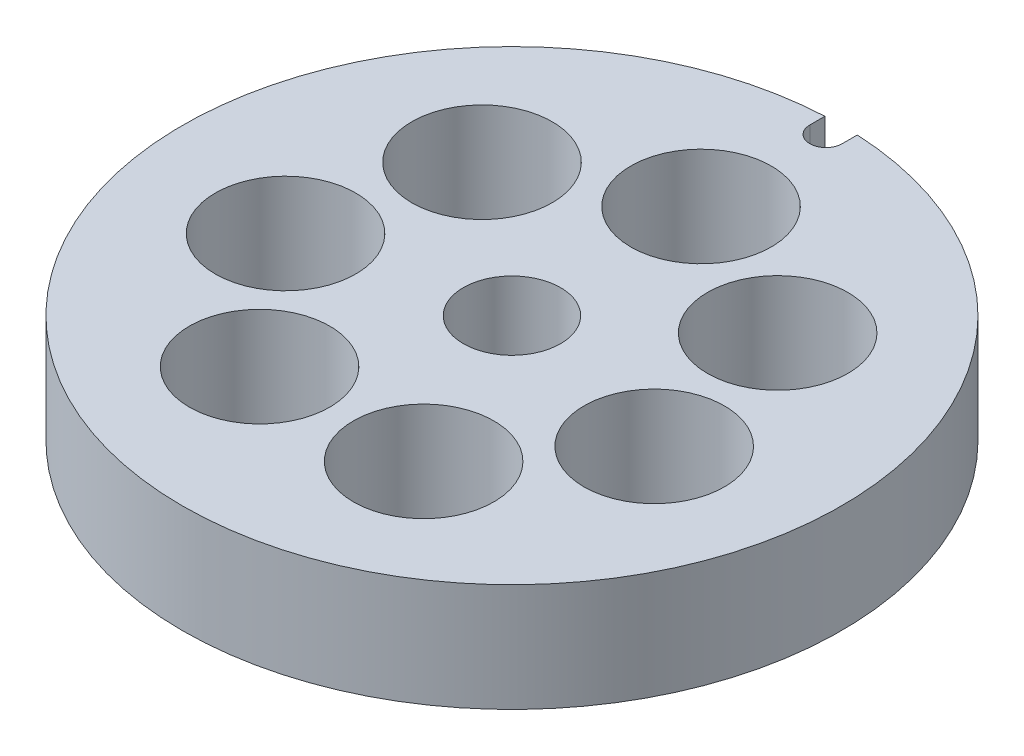
ISO-10303-21;
HEADER;
FILE_DESCRIPTION(('STEP AP214'),'2;1');
FILE_NAME('part.step','',(''),(''),'','','');
FILE_SCHEMA(('AUTOMOTIVE_DESIGN { 1 0 10303 214 1 1 1 1 }'));
ENDSEC;
DATA;
#1=APPLICATION_CONTEXT('core data for automotive mechanical design processes');
#2=APPLICATION_PROTOCOL_DEFINITION('international standard','automotive_design',2000,#1);
#3=PRODUCT_CONTEXT('',#1,'mechanical');
#4=PRODUCT('Part','Part','',(#3));
#5=PRODUCT_RELATED_PRODUCT_CATEGORY('part','',(#4));
#6=PRODUCT_DEFINITION_FORMATION('','',#4);
#7=PRODUCT_DEFINITION_CONTEXT('part definition',#1,'design');
#8=PRODUCT_DEFINITION('design','',#6,#7);
#9=PRODUCT_DEFINITION_SHAPE('','',#8);
#10=(LENGTH_UNIT() NAMED_UNIT(*) SI_UNIT(.MILLI.,.METRE.));
#11=(NAMED_UNIT(*) PLANE_ANGLE_UNIT() SI_UNIT($,.RADIAN.));
#12=(NAMED_UNIT(*) SI_UNIT($,.STERADIAN.) SOLID_ANGLE_UNIT());
#13=UNCERTAINTY_MEASURE_WITH_UNIT(LENGTH_MEASURE(1.E-05),#10,'distance_accuracy_value','');
#14=(GEOMETRIC_REPRESENTATION_CONTEXT(3) GLOBAL_UNCERTAINTY_ASSIGNED_CONTEXT((#13)) GLOBAL_UNIT_ASSIGNED_CONTEXT((#10,
#11,#12)) REPRESENTATION_CONTEXT('',''));
#15=CARTESIAN_POINT('',(0.,0.,0.));
#16=DIRECTION('',(0.,0.,1.));
#17=DIRECTION('',(1.,0.,0.));
#18=AXIS2_PLACEMENT_3D('',#15,#16,#17);
#19=CARTESIAN_POINT('',(0.,10.,-29.0630924234556));
#20=DIRECTION('',(0.,1.,0.));
#21=DIRECTION('',(0.,0.,1.));
#22=AXIS2_PLACEMENT_3D('',#19,#20,#21);
#23=PLANE('',#22);
#24=CARTESIAN_POINT('',(-17.0612384631819,10.,3.89411634423551));
#25=DIRECTION('',(0.,1.,0.));
#26=DIRECTION('',(0.,0.,1.));
#27=AXIS2_PLACEMENT_3D('',#24,#25,#26);
#28=CIRCLE('',#27,6.5);
#29=CARTESIAN_POINT('',(-17.0612384631819,10.,10.3941163442355));
#30=VERTEX_POINT('',#29);
#31=EDGE_CURVE('E149',#30,#30,#28,.T.);
#32=ORIENTED_EDGE('',*,*,#31,.F.);
#33=EDGE_LOOP('',(#32));
#34=FACE_BOUND('',#33,.T.);
#35=CARTESIAN_POINT('',(7.59296543455727,10.,15.7669551882923));
#36=DIRECTION('',(0.,1.,0.));
#37=DIRECTION('',(0.,0.,1.));
#38=AXIS2_PLACEMENT_3D('',#35,#36,#37);
#39=CIRCLE('',#38,6.5);
#40=CARTESIAN_POINT('',(7.59296543455727,10.,22.2669551882923));
#41=VERTEX_POINT('',#40);
#42=EDGE_CURVE('E137',#41,#41,#39,.T.);
#43=ORIENTED_EDGE('',*,*,#42,.F.);
#44=EDGE_LOOP('',(#43));
#45=FACE_BOUND('',#44,.T.);
#46=CARTESIAN_POINT('',(13.6820509431905,10.,-10.9110715325278));
#47=DIRECTION('',(0.,1.,0.));
#48=DIRECTION('',(0.,0.,1.));
#49=AXIS2_PLACEMENT_3D('',#46,#47,#48);
#50=CIRCLE('',#49,6.5);
#51=CARTESIAN_POINT('',(13.6820509431905,10.,-4.41107153252784));
#52=VERTEX_POINT('',#51);
#53=EDGE_CURVE('E125',#52,#52,#50,.T.);
#54=ORIENTED_EDGE('',*,*,#53,.F.);
#55=EDGE_LOOP('',(#54));
#56=FACE_BOUND('',#55,.T.);
#57=CARTESIAN_POINT('',(0.,10.,0.));
#58=DIRECTION('',(0.,1.,0.));
#59=DIRECTION('',(0.,0.,1.));
#60=AXIS2_PLACEMENT_3D('',#57,#58,#59);
#61=CIRCLE('',#60,4.5);
#62=CARTESIAN_POINT('',(0.,10.,4.5));
#63=VERTEX_POINT('',#62);
#64=EDGE_CURVE('E104',#63,#63,#61,.T.);
#65=ORIENTED_EDGE('',*,*,#64,.F.);
#66=EDGE_LOOP('',(#65));
#67=FACE_BOUND('',#66,.T.);
#68=CARTESIAN_POINT('',(0.,10.,-29.0630924234556));
#69=DIRECTION('',(0.,-1.,0.));
#70=DIRECTION('',(0.,0.,1.));
#71=AXIS2_PLACEMENT_3D('',#68,#69,#70);
#72=CIRCLE('',#71,1.5);
#73=CARTESIAN_POINT('',(1.5,10.,-29.0630924234556));
#74=VERTEX_POINT('',#73);
#75=CARTESIAN_POINT('',(-1.5,10.,-29.0630924234556));
#76=VERTEX_POINT('',#75);
#77=EDGE_CURVE('E89',#74,#76,#72,.T.);
#78=ORIENTED_EDGE('',*,*,#77,.T.);
#79=DIRECTION('',(0.,0.,-1.));
#80=VECTOR('',#79,1.);
#81=CARTESIAN_POINT('',(-1.5,10.,-30.4630924234556));
#82=LINE('',#81,#80);
#83=CARTESIAN_POINT('',(-1.5,10.,-30.4630924234556));
#84=VERTEX_POINT('',#83);
#85=EDGE_CURVE('E84',#76,#84,#82,.T.);
#86=ORIENTED_EDGE('',*,*,#85,.T.);
#87=CARTESIAN_POINT('',(0.,10.,0.));
#88=DIRECTION('',(0.,1.,0.));
#89=DIRECTION('',(0.,0.,1.));
#90=AXIS2_PLACEMENT_3D('',#87,#88,#89);
#91=CIRCLE('',#90,30.5);
#92=CARTESIAN_POINT('',(1.5,10.,-30.4630924234556));
#93=VERTEX_POINT('',#92);
#94=EDGE_CURVE('E87',#84,#93,#91,.T.);
#95=ORIENTED_EDGE('',*,*,#94,.T.);
#96=DIRECTION('',(0.,0.,1.));
#97=VECTOR('',#96,1.);
#98=CARTESIAN_POINT('',(1.5,10.,-29.0630924234556));
#99=LINE('',#98,#97);
#100=EDGE_CURVE('E54',#93,#74,#99,.T.);
#101=ORIENTED_EDGE('',*,*,#100,.T.);
#102=EDGE_LOOP('',(#78,#86,#95,#101));
#103=FACE_BOUND('',#102,.T.);
#104=CARTESIAN_POINT('',(0.,10.,-17.5));
#105=DIRECTION('',(0.,1.,0.));
#106=DIRECTION('',(0.,0.,1.));
#107=AXIS2_PLACEMENT_3D('',#104,#105,#106);
#108=CIRCLE('',#107,6.5);
#109=CARTESIAN_POINT('',(0.,10.,-11.));
#110=VERTEX_POINT('',#109);
#111=EDGE_CURVE('E119',#110,#110,#108,.T.);
#112=ORIENTED_EDGE('',*,*,#111,.F.);
#113=EDGE_LOOP('',(#112));
#114=FACE_BOUND('',#113,.T.);
#115=CARTESIAN_POINT('',(17.0612384631819,10.,3.8941163442355));
#116=DIRECTION('',(0.,1.,0.));
#117=DIRECTION('',(0.,0.,1.));
#118=AXIS2_PLACEMENT_3D('',#115,#116,#117);
#119=CIRCLE('',#118,6.50000000000001);
#120=CARTESIAN_POINT('',(17.0612384631819,10.,10.3941163442355));
#121=VERTEX_POINT('',#120);
#122=EDGE_CURVE('E131',#121,#121,#119,.T.);
#123=ORIENTED_EDGE('',*,*,#122,.F.);
#124=EDGE_LOOP('',(#123));
#125=FACE_BOUND('',#124,.T.);
#126=CARTESIAN_POINT('',(-7.59296543455727,10.,15.7669551882923));
#127=DIRECTION('',(0.,1.,0.));
#128=DIRECTION('',(0.,0.,1.));
#129=AXIS2_PLACEMENT_3D('',#126,#127,#128);
#130=CIRCLE('',#129,6.5);
#131=CARTESIAN_POINT('',(-7.59296543455727,10.,22.2669551882923));
#132=VERTEX_POINT('',#131);
#133=EDGE_CURVE('E143',#132,#132,#130,.T.);
#134=ORIENTED_EDGE('',*,*,#133,.F.);
#135=EDGE_LOOP('',(#134));
#136=FACE_BOUND('',#135,.T.);
#137=CARTESIAN_POINT('',(-13.6820509431905,10.,-10.9110715325278));
#138=DIRECTION('',(0.,1.,0.));
#139=DIRECTION('',(0.,0.,1.));
#140=AXIS2_PLACEMENT_3D('',#137,#138,#139);
#141=CIRCLE('',#140,6.5);
#142=CARTESIAN_POINT('',(-13.6820509431905,10.,-4.41107153252784));
#143=VERTEX_POINT('',#142);
#144=EDGE_CURVE('E155',#143,#143,#141,.T.);
#145=ORIENTED_EDGE('',*,*,#144,.F.);
#146=EDGE_LOOP('',(#145));
#147=FACE_BOUND('',#146,.T.);
#148=ADVANCED_FACE('F37',(#34,#45,#56,#67,#103,#114,#125,#136,#147),#23,.T.);
#149=CARTESIAN_POINT('',(0.,0.,-29.0630924234556));
#150=DIRECTION('',(0.,1.,0.));
#151=DIRECTION('',(0.,0.,1.));
#152=AXIS2_PLACEMENT_3D('',#149,#150,#151);
#153=PLANE('',#152);
#154=CARTESIAN_POINT('',(0.,0.,-29.0630924234556));
#155=DIRECTION('',(0.,-1.,0.));
#156=DIRECTION('',(0.,0.,1.));
#157=AXIS2_PLACEMENT_3D('',#154,#155,#156);
#158=CIRCLE('',#157,1.5);
#159=CARTESIAN_POINT('',(1.5,0.,-29.0630924234556));
#160=VERTEX_POINT('',#159);
#161=CARTESIAN_POINT('',(-1.5,0.,-29.0630924234556));
#162=VERTEX_POINT('',#161);
#163=EDGE_CURVE('E101',#160,#162,#158,.T.);
#164=ORIENTED_EDGE('',*,*,#163,.F.);
#165=DIRECTION('',(0.,0.,1.));
#166=VECTOR('',#165,1.);
#167=CARTESIAN_POINT('',(1.5,0.,-29.0630924234556));
#168=LINE('',#167,#166);
#169=CARTESIAN_POINT('',(1.5,0.,-30.4630924234556));
#170=VERTEX_POINT('',#169);
#171=EDGE_CURVE('E77',#170,#160,#168,.T.);
#172=ORIENTED_EDGE('',*,*,#171,.F.);
#173=CARTESIAN_POINT('',(0.,0.,0.));
#174=DIRECTION('',(0.,1.,0.));
#175=DIRECTION('',(0.,0.,1.));
#176=AXIS2_PLACEMENT_3D('',#173,#174,#175);
#177=CIRCLE('',#176,30.5);
#178=CARTESIAN_POINT('',(-1.5,0.,-30.4630924234556));
#179=VERTEX_POINT('',#178);
#180=EDGE_CURVE('E71',#179,#170,#177,.T.);
#181=ORIENTED_EDGE('',*,*,#180,.F.);
#182=DIRECTION('',(0.,0.,-1.));
#183=VECTOR('',#182,1.);
#184=CARTESIAN_POINT('',(-1.5,0.,-30.4630924234556));
#185=LINE('',#184,#183);
#186=EDGE_CURVE('E93',#162,#179,#185,.T.);
#187=ORIENTED_EDGE('',*,*,#186,.F.);
#188=EDGE_LOOP('',(#164,#172,#181,#187));
#189=FACE_BOUND('',#188,.T.);
#190=CARTESIAN_POINT('',(0.,0.,0.));
#191=DIRECTION('',(0.,1.,0.));
#192=DIRECTION('',(0.,0.,1.));
#193=AXIS2_PLACEMENT_3D('',#190,#191,#192);
#194=CIRCLE('',#193,4.5);
#195=CARTESIAN_POINT('',(0.,0.,4.5));
#196=VERTEX_POINT('',#195);
#197=EDGE_CURVE('E116',#196,#196,#194,.T.);
#198=ORIENTED_EDGE('',*,*,#197,.T.);
#199=EDGE_LOOP('',(#198));
#200=FACE_BOUND('',#199,.T.);
#201=CARTESIAN_POINT('',(0.,0.,-17.5));
#202=DIRECTION('',(0.,1.,0.));
#203=DIRECTION('',(0.,0.,1.));
#204=AXIS2_PLACEMENT_3D('',#201,#202,#203);
#205=CIRCLE('',#204,6.5);
#206=CARTESIAN_POINT('',(0.,0.,-11.));
#207=VERTEX_POINT('',#206);
#208=EDGE_CURVE('E122',#207,#207,#205,.T.);
#209=ORIENTED_EDGE('',*,*,#208,.T.);
#210=EDGE_LOOP('',(#209));
#211=FACE_BOUND('',#210,.T.);
#212=CARTESIAN_POINT('',(13.6820509431905,0.,-10.9110715325278));
#213=DIRECTION('',(0.,1.,0.));
#214=DIRECTION('',(0.,0.,1.));
#215=AXIS2_PLACEMENT_3D('',#212,#213,#214);
#216=CIRCLE('',#215,6.5);
#217=CARTESIAN_POINT('',(13.6820509431905,0.,-4.41107153252784));
#218=VERTEX_POINT('',#217);
#219=EDGE_CURVE('E128',#218,#218,#216,.T.);
#220=ORIENTED_EDGE('',*,*,#219,.T.);
#221=EDGE_LOOP('',(#220));
#222=FACE_BOUND('',#221,.T.);
#223=CARTESIAN_POINT('',(17.0612384631819,0.,3.8941163442355));
#224=DIRECTION('',(0.,1.,0.));
#225=DIRECTION('',(0.,0.,1.));
#226=AXIS2_PLACEMENT_3D('',#223,#224,#225);
#227=CIRCLE('',#226,6.50000000000001);
#228=CARTESIAN_POINT('',(17.0612384631819,0.,10.3941163442355));
#229=VERTEX_POINT('',#228);
#230=EDGE_CURVE('E134',#229,#229,#227,.T.);
#231=ORIENTED_EDGE('',*,*,#230,.T.);
#232=EDGE_LOOP('',(#231));
#233=FACE_BOUND('',#232,.T.);
#234=CARTESIAN_POINT('',(7.59296543455727,0.,15.7669551882923));
#235=DIRECTION('',(0.,1.,0.));
#236=DIRECTION('',(0.,0.,1.));
#237=AXIS2_PLACEMENT_3D('',#234,#235,#236);
#238=CIRCLE('',#237,6.5);
#239=CARTESIAN_POINT('',(7.59296543455727,0.,22.2669551882923));
#240=VERTEX_POINT('',#239);
#241=EDGE_CURVE('E140',#240,#240,#238,.T.);
#242=ORIENTED_EDGE('',*,*,#241,.T.);
#243=EDGE_LOOP('',(#242));
#244=FACE_BOUND('',#243,.T.);
#245=CARTESIAN_POINT('',(-7.59296543455727,0.,15.7669551882923));
#246=DIRECTION('',(0.,1.,0.));
#247=DIRECTION('',(0.,0.,1.));
#248=AXIS2_PLACEMENT_3D('',#245,#246,#247);
#249=CIRCLE('',#248,6.5);
#250=CARTESIAN_POINT('',(-7.59296543455727,0.,22.2669551882923));
#251=VERTEX_POINT('',#250);
#252=EDGE_CURVE('E146',#251,#251,#249,.T.);
#253=ORIENTED_EDGE('',*,*,#252,.T.);
#254=EDGE_LOOP('',(#253));
#255=FACE_BOUND('',#254,.T.);
#256=CARTESIAN_POINT('',(-17.0612384631819,0.,3.89411634423551));
#257=DIRECTION('',(0.,1.,0.));
#258=DIRECTION('',(0.,0.,1.));
#259=AXIS2_PLACEMENT_3D('',#256,#257,#258);
#260=CIRCLE('',#259,6.5);
#261=CARTESIAN_POINT('',(-17.0612384631819,0.,10.3941163442355));
#262=VERTEX_POINT('',#261);
#263=EDGE_CURVE('E152',#262,#262,#260,.T.);
#264=ORIENTED_EDGE('',*,*,#263,.T.);
#265=EDGE_LOOP('',(#264));
#266=FACE_BOUND('',#265,.T.);
#267=CARTESIAN_POINT('',(-13.6820509431905,0.,-10.9110715325278));
#268=DIRECTION('',(0.,1.,0.));
#269=DIRECTION('',(0.,0.,1.));
#270=AXIS2_PLACEMENT_3D('',#267,#268,#269);
#271=CIRCLE('',#270,6.5);
#272=CARTESIAN_POINT('',(-13.6820509431905,0.,-4.41107153252784));
#273=VERTEX_POINT('',#272);
#274=EDGE_CURVE('E158',#273,#273,#271,.T.);
#275=ORIENTED_EDGE('',*,*,#274,.T.);
#276=EDGE_LOOP('',(#275));
#277=FACE_BOUND('',#276,.T.);
#278=ADVANCED_FACE('F112',(#189,#200,#211,#222,#233,#244,#255,#266,#277),#153,.F.);
#279=CARTESIAN_POINT('',(0.,10.,-29.0630924234556));
#280=DIRECTION('',(0.,-1.,0.));
#281=DIRECTION('',(0.,0.,-1.));
#282=AXIS2_PLACEMENT_3D('',#279,#280,#281);
#283=CYLINDRICAL_SURFACE('',#282,1.5);
#284=ORIENTED_EDGE('',*,*,#163,.T.);
#285=DIRECTION('',(0.,-1.,0.));
#286=VECTOR('',#285,1.);
#287=CARTESIAN_POINT('',(-1.5,10.,-29.0630924234556));
#288=LINE('',#287,#286);
#289=EDGE_CURVE('E11',#76,#162,#288,.T.);
#290=ORIENTED_EDGE('',*,*,#289,.F.);
#291=ORIENTED_EDGE('',*,*,#77,.F.);
#292=DIRECTION('',(0.,-1.,0.));
#293=VECTOR('',#292,1.);
#294=CARTESIAN_POINT('',(1.5,10.,-29.0630924234556));
#295=LINE('',#294,#293);
#296=EDGE_CURVE('E97',#74,#160,#295,.T.);
#297=ORIENTED_EDGE('',*,*,#296,.T.);
#298=EDGE_LOOP('',(#284,#290,#291,#297));
#299=FACE_BOUND('',#298,.T.);
#300=ADVANCED_FACE('F39',(#299),#283,.F.);
#301=CARTESIAN_POINT('',(-1.5,10.,-30.4630924234556));
#302=DIRECTION('',(-1.,0.,0.));
#303=DIRECTION('',(0.,0.,1.));
#304=AXIS2_PLACEMENT_3D('',#301,#302,#303);
#305=PLANE('',#304);
#306=ORIENTED_EDGE('',*,*,#186,.T.);
#307=DIRECTION('',(0.,-1.,0.));
#308=VECTOR('',#307,1.);
#309=CARTESIAN_POINT('',(-1.5,10.,-30.4630924234556));
#310=LINE('',#309,#308);
#311=EDGE_CURVE('E46',#84,#179,#310,.T.);
#312=ORIENTED_EDGE('',*,*,#311,.F.);
#313=ORIENTED_EDGE('',*,*,#85,.F.);
#314=ORIENTED_EDGE('',*,*,#289,.T.);
#315=EDGE_LOOP('',(#306,#312,#313,#314));
#316=FACE_BOUND('',#315,.T.);
#317=ADVANCED_FACE('F92',(#316),#305,.F.);
#318=CARTESIAN_POINT('',(0.,10.,0.));
#319=DIRECTION('',(0.,-1.,0.));
#320=DIRECTION('',(0.,0.,-1.));
#321=AXIS2_PLACEMENT_3D('',#318,#319,#320);
#322=CYLINDRICAL_SURFACE('',#321,30.5);
#323=ORIENTED_EDGE('',*,*,#180,.T.);
#324=DIRECTION('',(0.,-1.,0.));
#325=VECTOR('',#324,1.);
#326=CARTESIAN_POINT('',(1.5,10.,-30.4630924234556));
#327=LINE('',#326,#325);
#328=EDGE_CURVE('E94',#93,#170,#327,.T.);
#329=ORIENTED_EDGE('',*,*,#328,.F.);
#330=ORIENTED_EDGE('',*,*,#94,.F.);
#331=ORIENTED_EDGE('',*,*,#311,.T.);
#332=EDGE_LOOP('',(#323,#329,#330,#331));
#333=FACE_BOUND('',#332,.T.);
#334=ADVANCED_FACE('F95',(#333),#322,.T.);
#335=CARTESIAN_POINT('',(1.5,10.,-29.0630924234556));
#336=DIRECTION('',(1.,0.,0.));
#337=DIRECTION('',(0.,0.,-1.));
#338=AXIS2_PLACEMENT_3D('',#335,#336,#337);
#339=PLANE('',#338);
#340=ORIENTED_EDGE('',*,*,#171,.T.);
#341=ORIENTED_EDGE('',*,*,#296,.F.);
#342=ORIENTED_EDGE('',*,*,#100,.F.);
#343=ORIENTED_EDGE('',*,*,#328,.T.);
#344=EDGE_LOOP('',(#340,#341,#342,#343));
#345=FACE_BOUND('',#344,.T.);
#346=ADVANCED_FACE('F109',(#345),#339,.F.);
#347=CARTESIAN_POINT('',(0.,10.,0.));
#348=DIRECTION('',(0.,-1.,0.));
#349=DIRECTION('',(0.,0.,-1.));
#350=AXIS2_PLACEMENT_3D('',#347,#348,#349);
#351=CYLINDRICAL_SURFACE('',#350,4.5);
#352=ORIENTED_EDGE('',*,*,#64,.T.);
#353=EDGE_LOOP('',(#352));
#354=FACE_BOUND('',#353,.T.);
#355=ORIENTED_EDGE('',*,*,#197,.F.);
#356=EDGE_LOOP('',(#355));
#357=FACE_BOUND('',#356,.T.);
#358=ADVANCED_FACE('F177',(#354,#357),#351,.F.);
#359=CARTESIAN_POINT('',(0.,10.,-17.5));
#360=DIRECTION('',(0.,-1.,0.));
#361=DIRECTION('',(0.,0.,-1.));
#362=AXIS2_PLACEMENT_3D('',#359,#360,#361);
#363=CYLINDRICAL_SURFACE('',#362,6.5);
#364=ORIENTED_EDGE('',*,*,#111,.T.);
#365=EDGE_LOOP('',(#364));
#366=FACE_BOUND('',#365,.T.);
#367=ORIENTED_EDGE('',*,*,#208,.F.);
#368=EDGE_LOOP('',(#367));
#369=FACE_BOUND('',#368,.T.);
#370=ADVANCED_FACE('F223',(#366,#369),#363,.F.);
#371=CARTESIAN_POINT('',(13.6820509431905,10.,-10.9110715325278));
#372=DIRECTION('',(0.,-1.,0.));
#373=DIRECTION('',(0.,0.,-1.));
#374=AXIS2_PLACEMENT_3D('',#371,#372,#373);
#375=CYLINDRICAL_SURFACE('',#374,6.5);
#376=ORIENTED_EDGE('',*,*,#53,.T.);
#377=EDGE_LOOP('',(#376));
#378=FACE_BOUND('',#377,.T.);
#379=ORIENTED_EDGE('',*,*,#219,.F.);
#380=EDGE_LOOP('',(#379));
#381=FACE_BOUND('',#380,.T.);
#382=ADVANCED_FACE('F231',(#378,#381),#375,.F.);
#383=CARTESIAN_POINT('',(17.0612384631819,10.,3.8941163442355));
#384=DIRECTION('',(0.,-1.,0.));
#385=DIRECTION('',(0.,0.,-1.));
#386=AXIS2_PLACEMENT_3D('',#383,#384,#385);
#387=CYLINDRICAL_SURFACE('',#386,6.50000000000001);
#388=ORIENTED_EDGE('',*,*,#122,.T.);
#389=EDGE_LOOP('',(#388));
#390=FACE_BOUND('',#389,.T.);
#391=ORIENTED_EDGE('',*,*,#230,.F.);
#392=EDGE_LOOP('',(#391));
#393=FACE_BOUND('',#392,.T.);
#394=ADVANCED_FACE('F239',(#390,#393),#387,.F.);
#395=CARTESIAN_POINT('',(7.59296543455727,10.,15.7669551882923));
#396=DIRECTION('',(0.,-1.,0.));
#397=DIRECTION('',(0.,0.,-1.));
#398=AXIS2_PLACEMENT_3D('',#395,#396,#397);
#399=CYLINDRICAL_SURFACE('',#398,6.5);
#400=ORIENTED_EDGE('',*,*,#42,.T.);
#401=EDGE_LOOP('',(#400));
#402=FACE_BOUND('',#401,.T.);
#403=ORIENTED_EDGE('',*,*,#241,.F.);
#404=EDGE_LOOP('',(#403));
#405=FACE_BOUND('',#404,.T.);
#406=ADVANCED_FACE('F248',(#402,#405),#399,.F.);
#407=CARTESIAN_POINT('',(-7.59296543455727,10.,15.7669551882923));
#408=DIRECTION('',(0.,-1.,0.));
#409=DIRECTION('',(0.,0.,-1.));
#410=AXIS2_PLACEMENT_3D('',#407,#408,#409);
#411=CYLINDRICAL_SURFACE('',#410,6.5);
#412=ORIENTED_EDGE('',*,*,#133,.T.);
#413=EDGE_LOOP('',(#412));
#414=FACE_BOUND('',#413,.T.);
#415=ORIENTED_EDGE('',*,*,#252,.F.);
#416=EDGE_LOOP('',(#415));
#417=FACE_BOUND('',#416,.T.);
#418=ADVANCED_FACE('F257',(#414,#417),#411,.F.);
#419=CARTESIAN_POINT('',(-17.0612384631819,10.,3.89411634423551));
#420=DIRECTION('',(0.,-1.,0.));
#421=DIRECTION('',(0.,0.,-1.));
#422=AXIS2_PLACEMENT_3D('',#419,#420,#421);
#423=CYLINDRICAL_SURFACE('',#422,6.5);
#424=ORIENTED_EDGE('',*,*,#31,.T.);
#425=EDGE_LOOP('',(#424));
#426=FACE_BOUND('',#425,.T.);
#427=ORIENTED_EDGE('',*,*,#263,.F.);
#428=EDGE_LOOP('',(#427));
#429=FACE_BOUND('',#428,.T.);
#430=ADVANCED_FACE('F266',(#426,#429),#423,.F.);
#431=CARTESIAN_POINT('',(-13.6820509431905,10.,-10.9110715325278));
#432=DIRECTION('',(0.,-1.,0.));
#433=DIRECTION('',(0.,0.,-1.));
#434=AXIS2_PLACEMENT_3D('',#431,#432,#433);
#435=CYLINDRICAL_SURFACE('',#434,6.5);
#436=ORIENTED_EDGE('',*,*,#144,.T.);
#437=EDGE_LOOP('',(#436));
#438=FACE_BOUND('',#437,.T.);
#439=ORIENTED_EDGE('',*,*,#274,.F.);
#440=EDGE_LOOP('',(#439));
#441=FACE_BOUND('',#440,.T.);
#442=ADVANCED_FACE('F164',(#438,#441),#435,.F.);
#443=CLOSED_SHELL('',(#148,#278,#300,#317,#334,#346,#358,#370,#382,#394,#406,#418,#430,#442));
#444=MANIFOLD_SOLID_BREP('B2',#443);
#445=ADVANCED_BREP_SHAPE_REPRESENTATION('',(#18,#444),#14);
#446=SHAPE_DEFINITION_REPRESENTATION(#9,#445);
ENDSEC;
END-ISO-10303-21;
